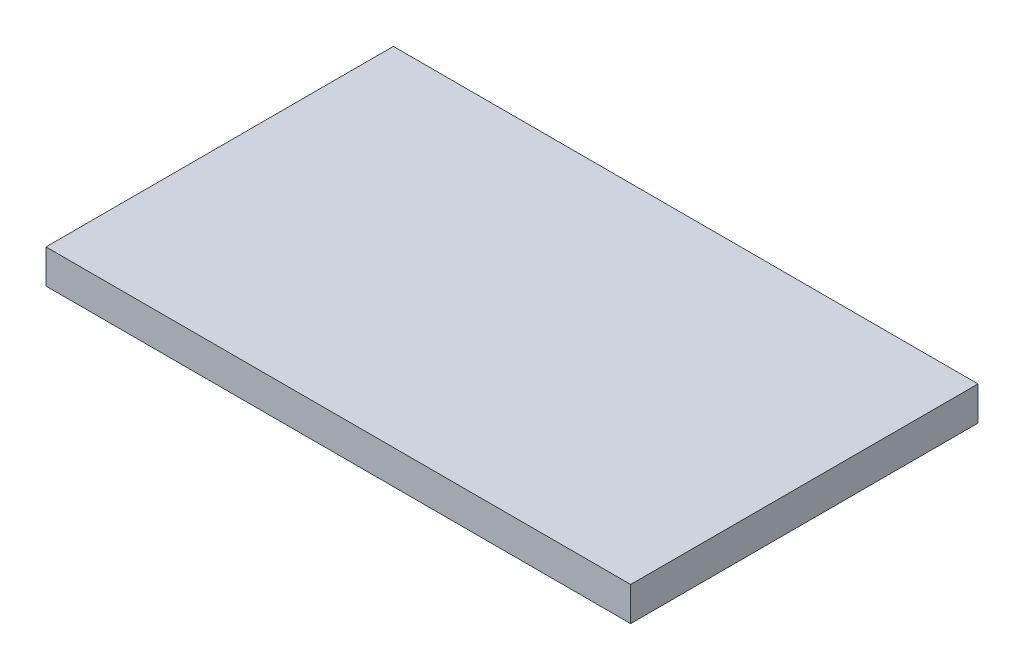
ISO-10303-21;
HEADER;
FILE_DESCRIPTION(('STEP AP214'),'2;1');
FILE_NAME('part.step','',(''),(''),'','','');
FILE_SCHEMA(('AUTOMOTIVE_DESIGN { 1 0 10303 214 1 1 1 1 }'));
ENDSEC;
DATA;
#1=APPLICATION_CONTEXT('core data for automotive mechanical design processes');
#2=APPLICATION_PROTOCOL_DEFINITION('international standard','automotive_design',2000,#1);
#3=PRODUCT_CONTEXT('',#1,'mechanical');
#4=PRODUCT('Part','Part','',(#3));
#5=PRODUCT_RELATED_PRODUCT_CATEGORY('part','',(#4));
#6=PRODUCT_DEFINITION_FORMATION('','',#4);
#7=PRODUCT_DEFINITION_CONTEXT('part definition',#1,'design');
#8=PRODUCT_DEFINITION('design','',#6,#7);
#9=PRODUCT_DEFINITION_SHAPE('','',#8);
#10=(LENGTH_UNIT() NAMED_UNIT(*) SI_UNIT(.MILLI.,.METRE.));
#11=(NAMED_UNIT(*) PLANE_ANGLE_UNIT() SI_UNIT($,.RADIAN.));
#12=(NAMED_UNIT(*) SI_UNIT($,.STERADIAN.) SOLID_ANGLE_UNIT());
#13=UNCERTAINTY_MEASURE_WITH_UNIT(LENGTH_MEASURE(1.E-05),#10,'distance_accuracy_value','');
#14=(GEOMETRIC_REPRESENTATION_CONTEXT(3) GLOBAL_UNCERTAINTY_ASSIGNED_CONTEXT((#13)) GLOBAL_UNIT_ASSIGNED_CONTEXT((#10,
#11,#12)) REPRESENTATION_CONTEXT('',''));
#15=CARTESIAN_POINT('',(0.,0.,0.));
#16=DIRECTION('',(0.,0.,1.));
#17=DIRECTION('',(1.,0.,0.));
#18=AXIS2_PLACEMENT_3D('',#15,#16,#17);
#19=CARTESIAN_POINT('',(62.5,691.,-757.5));
#20=DIRECTION('',(-1.,0.,0.));
#21=DIRECTION('',(0.,0.,1.));
#22=AXIS2_PLACEMENT_3D('',#19,#20,#21);
#23=PLANE('',#22);
#24=DIRECTION('',(0.,-1.,0.));
#25=VECTOR('',#24,1.);
#26=CARTESIAN_POINT('',(62.5,691.,0.));
#27=LINE('',#26,#25);
#28=CARTESIAN_POINT('',(62.5,765.,0.));
#29=VERTEX_POINT('',#28);
#30=CARTESIAN_POINT('',(62.5,691.,0.));
#31=VERTEX_POINT('',#30);
#32=EDGE_CURVE('E103',#29,#31,#27,.T.);
#33=ORIENTED_EDGE('',*,*,#32,.F.);
#34=DIRECTION('',(0.,0.,1.));
#35=VECTOR('',#34,1.);
#36=CARTESIAN_POINT('',(62.5,765.,-757.5));
#37=LINE('',#36,#35);
#38=CARTESIAN_POINT('',(62.5,765.,-757.5));
#39=VERTEX_POINT('',#38);
#40=EDGE_CURVE('E11',#39,#29,#37,.T.);
#41=ORIENTED_EDGE('',*,*,#40,.F.);
#42=DIRECTION('',(0.,-1.,0.));
#43=VECTOR('',#42,1.);
#44=CARTESIAN_POINT('',(62.5,691.,-757.5));
#45=LINE('',#44,#43);
#46=CARTESIAN_POINT('',(62.5,691.,-757.5));
#47=VERTEX_POINT('',#46);
#48=EDGE_CURVE('E97',#39,#47,#45,.T.);
#49=ORIENTED_EDGE('',*,*,#48,.T.);
#50=DIRECTION('',(0.,0.,1.));
#51=VECTOR('',#50,1.);
#52=CARTESIAN_POINT('',(62.5,691.,-757.5));
#53=LINE('',#52,#51);
#54=EDGE_CURVE('E42',#47,#31,#53,.T.);
#55=ORIENTED_EDGE('',*,*,#54,.T.);
#56=EDGE_LOOP('',(#33,#41,#49,#55));
#57=FACE_BOUND('',#56,.T.);
#58=ADVANCED_FACE('F39',(#57),#23,.T.);
#59=CARTESIAN_POINT('',(62.5,765.,-757.5));
#60=DIRECTION('',(0.,1.,0.));
#61=DIRECTION('',(0.,0.,1.));
#62=AXIS2_PLACEMENT_3D('',#59,#60,#61);
#63=PLANE('',#62);
#64=DIRECTION('',(-1.,0.,0.));
#65=VECTOR('',#64,1.);
#66=CARTESIAN_POINT('',(62.5,765.,0.));
#67=LINE('',#66,#65);
#68=CARTESIAN_POINT('',(1337.5,765.,0.));
#69=VERTEX_POINT('',#68);
#70=EDGE_CURVE('E99',#69,#29,#67,.T.);
#71=ORIENTED_EDGE('',*,*,#70,.F.);
#72=DIRECTION('',(0.,0.,1.));
#73=VECTOR('',#72,1.);
#74=CARTESIAN_POINT('',(1337.5,765.,-757.5));
#75=LINE('',#74,#73);
#76=CARTESIAN_POINT('',(1337.5,765.,-757.5));
#77=VERTEX_POINT('',#76);
#78=EDGE_CURVE('E48',#77,#69,#75,.T.);
#79=ORIENTED_EDGE('',*,*,#78,.F.);
#80=DIRECTION('',(-1.,0.,0.));
#81=VECTOR('',#80,1.);
#82=CARTESIAN_POINT('',(62.5,765.,-757.5));
#83=LINE('',#82,#81);
#84=EDGE_CURVE('E94',#77,#39,#83,.T.);
#85=ORIENTED_EDGE('',*,*,#84,.T.);
#86=ORIENTED_EDGE('',*,*,#40,.T.);
#87=EDGE_LOOP('',(#71,#79,#85,#86));
#88=FACE_BOUND('',#87,.T.);
#89=ADVANCED_FACE('F113',(#88),#63,.T.);
#90=CARTESIAN_POINT('',(1337.5,691.,-757.5));
#91=DIRECTION('',(1.,0.,0.));
#92=DIRECTION('',(0.,0.,-1.));
#93=AXIS2_PLACEMENT_3D('',#90,#91,#92);
#94=PLANE('',#93);
#95=DIRECTION('',(0.,1.,0.));
#96=VECTOR('',#95,1.);
#97=CARTESIAN_POINT('',(1337.5,691.,0.));
#98=LINE('',#97,#96);
#99=CARTESIAN_POINT('',(1337.5,691.,0.));
#100=VERTEX_POINT('',#99);
#101=EDGE_CURVE('E89',#100,#69,#98,.T.);
#102=ORIENTED_EDGE('',*,*,#101,.F.);
#103=DIRECTION('',(0.,0.,1.));
#104=VECTOR('',#103,1.);
#105=CARTESIAN_POINT('',(1337.5,691.,-757.5));
#106=LINE('',#105,#104);
#107=CARTESIAN_POINT('',(1337.5,691.,-757.5));
#108=VERTEX_POINT('',#107);
#109=EDGE_CURVE('E84',#108,#100,#106,.T.);
#110=ORIENTED_EDGE('',*,*,#109,.F.);
#111=DIRECTION('',(0.,1.,0.));
#112=VECTOR('',#111,1.);
#113=CARTESIAN_POINT('',(1337.5,691.,-757.5));
#114=LINE('',#113,#112);
#115=EDGE_CURVE('E87',#108,#77,#114,.T.);
#116=ORIENTED_EDGE('',*,*,#115,.T.);
#117=ORIENTED_EDGE('',*,*,#78,.T.);
#118=EDGE_LOOP('',(#102,#110,#116,#117));
#119=FACE_BOUND('',#118,.T.);
#120=ADVANCED_FACE('F86',(#119),#94,.T.);
#121=CARTESIAN_POINT('',(62.5,691.,-757.5));
#122=DIRECTION('',(0.,-1.,0.));
#123=DIRECTION('',(0.,0.,-1.));
#124=AXIS2_PLACEMENT_3D('',#121,#122,#123);
#125=PLANE('',#124);
#126=DIRECTION('',(1.,0.,0.));
#127=VECTOR('',#126,1.);
#128=CARTESIAN_POINT('',(62.5,691.,0.));
#129=LINE('',#128,#127);
#130=EDGE_CURVE('E106',#31,#100,#129,.T.);
#131=ORIENTED_EDGE('',*,*,#130,.F.);
#132=ORIENTED_EDGE('',*,*,#54,.F.);
#133=DIRECTION('',(1.,0.,0.));
#134=VECTOR('',#133,1.);
#135=CARTESIAN_POINT('',(62.5,691.,-757.5));
#136=LINE('',#135,#134);
#137=EDGE_CURVE('E93',#47,#108,#136,.T.);
#138=ORIENTED_EDGE('',*,*,#137,.T.);
#139=ORIENTED_EDGE('',*,*,#109,.T.);
#140=EDGE_LOOP('',(#131,#132,#138,#139));
#141=FACE_BOUND('',#140,.T.);
#142=ADVANCED_FACE('F96',(#141),#125,.T.);
#143=CARTESIAN_POINT('',(0.,0.,-757.5));
#144=DIRECTION('',(0.,0.,-1.));
#145=DIRECTION('',(-1.,0.,0.));
#146=AXIS2_PLACEMENT_3D('',#143,#144,#145);
#147=PLANE('',#146);
#148=ORIENTED_EDGE('',*,*,#48,.F.);
#149=ORIENTED_EDGE('',*,*,#84,.F.);
#150=ORIENTED_EDGE('',*,*,#115,.F.);
#151=ORIENTED_EDGE('',*,*,#137,.F.);
#152=EDGE_LOOP('',(#148,#149,#150,#151));
#153=FACE_BOUND('',#152,.T.);
#154=ADVANCED_FACE('F92',(#153),#147,.T.);
#155=CARTESIAN_POINT('',(0.,0.,0.));
#156=DIRECTION('',(0.,0.,-1.));
#157=DIRECTION('',(-1.,0.,0.));
#158=AXIS2_PLACEMENT_3D('',#155,#156,#157);
#159=PLANE('',#158);
#160=ORIENTED_EDGE('',*,*,#32,.T.);
#161=ORIENTED_EDGE('',*,*,#130,.T.);
#162=ORIENTED_EDGE('',*,*,#101,.T.);
#163=ORIENTED_EDGE('',*,*,#70,.T.);
#164=EDGE_LOOP('',(#160,#161,#162,#163));
#165=FACE_BOUND('',#164,.T.);
#166=ADVANCED_FACE('F112',(#165),#159,.F.);
#167=CLOSED_SHELL('',(#58,#89,#120,#142,#154,#166));
#168=MANIFOLD_SOLID_BREP('B2',#167);
#169=ADVANCED_BREP_SHAPE_REPRESENTATION('',(#18,#168),#14);
#170=SHAPE_DEFINITION_REPRESENTATION(#9,#169);
ENDSEC;
END-ISO-10303-21;
